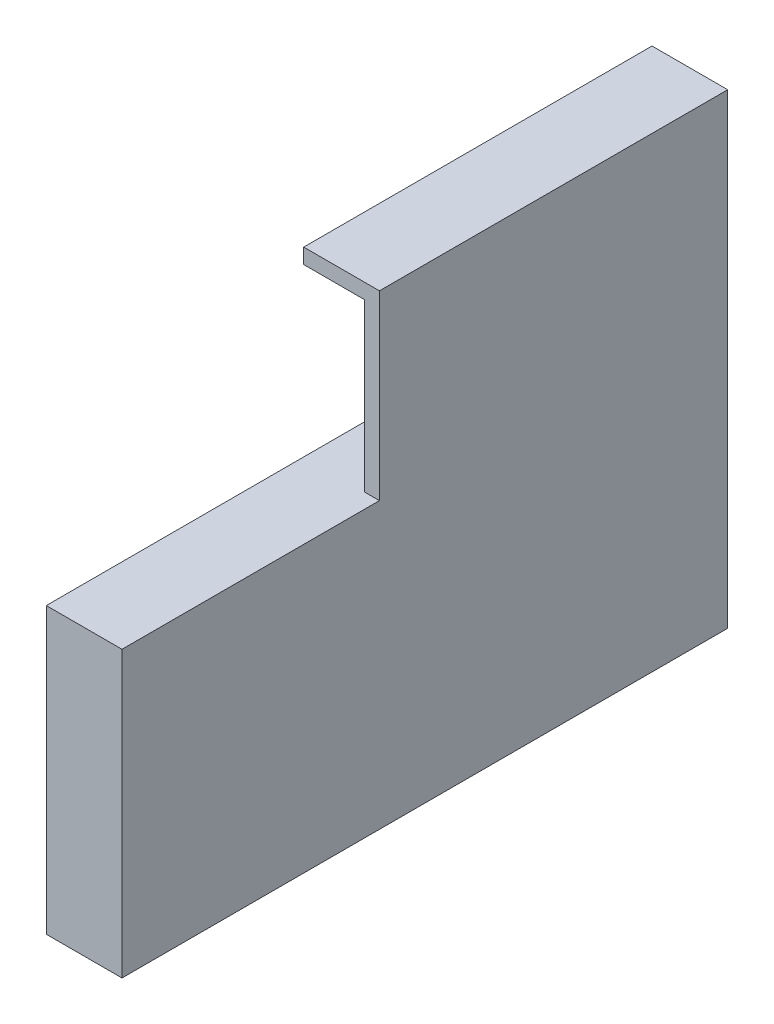
ISO-10303-21;
HEADER;
FILE_DESCRIPTION(('STEP AP214'),'2;1');
FILE_NAME('part.step','',(''),(''),'','','');
FILE_SCHEMA(('AUTOMOTIVE_DESIGN { 1 0 10303 214 1 1 1 1 }'));
ENDSEC;
DATA;
#1=APPLICATION_CONTEXT('core data for automotive mechanical design processes');
#2=APPLICATION_PROTOCOL_DEFINITION('international standard','automotive_design',2000,#1);
#3=PRODUCT_CONTEXT('',#1,'mechanical');
#4=PRODUCT('Part','Part','',(#3));
#5=PRODUCT_RELATED_PRODUCT_CATEGORY('part','',(#4));
#6=PRODUCT_DEFINITION_FORMATION('','',#4);
#7=PRODUCT_DEFINITION_CONTEXT('part definition',#1,'design');
#8=PRODUCT_DEFINITION('design','',#6,#7);
#9=PRODUCT_DEFINITION_SHAPE('','',#8);
#10=(LENGTH_UNIT() NAMED_UNIT(*) SI_UNIT(.MILLI.,.METRE.));
#11=(NAMED_UNIT(*) PLANE_ANGLE_UNIT() SI_UNIT($,.RADIAN.));
#12=(NAMED_UNIT(*) SI_UNIT($,.STERADIAN.) SOLID_ANGLE_UNIT());
#13=UNCERTAINTY_MEASURE_WITH_UNIT(LENGTH_MEASURE(1.E-05),#10,'distance_accuracy_value','');
#14=(GEOMETRIC_REPRESENTATION_CONTEXT(3) GLOBAL_UNCERTAINTY_ASSIGNED_CONTEXT((#13)) GLOBAL_UNIT_ASSIGNED_CONTEXT((#10,
#11,#12)) REPRESENTATION_CONTEXT('',''));
#15=CARTESIAN_POINT('',(0.,0.,0.));
#16=DIRECTION('',(0.,0.,1.));
#17=DIRECTION('',(1.,0.,0.));
#18=AXIS2_PLACEMENT_3D('',#15,#16,#17);
#19=CARTESIAN_POINT('',(-10.,44.5,0.));
#20=DIRECTION('',(0.,1.,0.));
#21=DIRECTION('',(0.,0.,1.));
#22=AXIS2_PLACEMENT_3D('',#19,#20,#21);
#23=PLANE('',#22);
#24=DIRECTION('',(0.,0.,1.));
#25=VECTOR('',#24,1.);
#26=CARTESIAN_POINT('',(2.5,44.5,0.));
#27=LINE('',#26,#25);
#28=CARTESIAN_POINT('',(2.5,44.5,-40.));
#29=VERTEX_POINT('',#28);
#30=CARTESIAN_POINT('',(2.5,44.5,2.50000000000003));
#31=VERTEX_POINT('',#30);
#32=EDGE_CURVE('E214',#29,#31,#27,.T.);
#33=ORIENTED_EDGE('',*,*,#32,.F.);
#34=DIRECTION('',(1.,0.,0.));
#35=VECTOR('',#34,1.);
#36=CARTESIAN_POINT('',(0.,44.5,-40.));
#37=LINE('',#36,#35);
#38=CARTESIAN_POINT('',(0.,44.5,-40.));
#39=VERTEX_POINT('',#38);
#40=EDGE_CURVE('E321',#39,#29,#37,.T.);
#41=ORIENTED_EDGE('',*,*,#40,.F.);
#42=DIRECTION('',(0.,0.,1.));
#43=VECTOR('',#42,1.);
#44=CARTESIAN_POINT('',(0.,44.5,0.));
#45=LINE('',#44,#43);
#46=CARTESIAN_POINT('',(0.,44.5,-95.));
#47=VERTEX_POINT('',#46);
#48=EDGE_CURVE('E325',#47,#39,#45,.T.);
#49=ORIENTED_EDGE('',*,*,#48,.F.);
#50=DIRECTION('',(1.,0.,0.));
#51=VECTOR('',#50,1.);
#52=CARTESIAN_POINT('',(-10.,44.5,-95.));
#53=LINE('',#52,#51);
#54=CARTESIAN_POINT('',(-10.,44.5,-95.));
#55=VERTEX_POINT('',#54);
#56=EDGE_CURVE('E98',#55,#47,#53,.T.);
#57=ORIENTED_EDGE('',*,*,#56,.F.);
#58=DIRECTION('',(0.,0.,1.));
#59=VECTOR('',#58,1.);
#60=CARTESIAN_POINT('',(-10.,44.5,0.));
#61=LINE('',#60,#59);
#62=CARTESIAN_POINT('',(-10.,44.5,2.50000000000003));
#63=VERTEX_POINT('',#62);
#64=EDGE_CURVE('E248',#55,#63,#61,.T.);
#65=ORIENTED_EDGE('',*,*,#64,.T.);
#66=DIRECTION('',(1.,0.,0.));
#67=VECTOR('',#66,1.);
#68=CARTESIAN_POINT('',(-10.,44.5,2.50000000000003));
#69=LINE('',#68,#67);
#70=EDGE_CURVE('E251',#63,#31,#69,.T.);
#71=ORIENTED_EDGE('',*,*,#70,.T.);
#72=EDGE_LOOP('',(#33,#41,#49,#57,#65,#71));
#73=FACE_BOUND('',#72,.T.);
#74=ADVANCED_FACE('F83',(#73),#23,.T.);
#75=CARTESIAN_POINT('',(-10.,0.,-95.));
#76=DIRECTION('',(0.,0.,1.));
#77=DIRECTION('',(1.,0.,0.));
#78=AXIS2_PLACEMENT_3D('',#75,#76,#77);
#79=PLANE('',#78);
#80=ORIENTED_EDGE('',*,*,#56,.T.);
#81=DIRECTION('',(0.,-1.,0.));
#82=VECTOR('',#81,1.);
#83=CARTESIAN_POINT('',(0.,0.,-95.));
#84=LINE('',#83,#82);
#85=CARTESIAN_POINT('',(0.,72.,-95.));
#86=VERTEX_POINT('',#85);
#87=EDGE_CURVE('E180',#86,#47,#84,.T.);
#88=ORIENTED_EDGE('',*,*,#87,.F.);
#89=DIRECTION('',(1.,0.,0.));
#90=VECTOR('',#89,1.);
#91=CARTESIAN_POINT('',(-10.,72.,-95.));
#92=LINE('',#91,#90);
#93=CARTESIAN_POINT('',(-10.,72.,-95.));
#94=VERTEX_POINT('',#93);
#95=EDGE_CURVE('E190',#94,#86,#92,.T.);
#96=ORIENTED_EDGE('',*,*,#95,.F.);
#97=DIRECTION('',(0.,-1.,0.));
#98=VECTOR('',#97,1.);
#99=CARTESIAN_POINT('',(-10.,0.,-95.));
#100=LINE('',#99,#98);
#101=EDGE_CURVE('E345',#94,#55,#100,.T.);
#102=ORIENTED_EDGE('',*,*,#101,.T.);
#103=EDGE_LOOP('',(#80,#88,#96,#102));
#104=FACE_BOUND('',#103,.T.);
#105=ADVANCED_FACE('F188',(#104),#79,.T.);
#106=CARTESIAN_POINT('',(-10.,72.,0.));
#107=DIRECTION('',(0.,-1.,0.));
#108=DIRECTION('',(0.,0.,-1.));
#109=AXIS2_PLACEMENT_3D('',#106,#107,#108);
#110=PLANE('',#109);
#111=ORIENTED_EDGE('',*,*,#95,.T.);
#112=DIRECTION('',(0.,0.,-1.));
#113=VECTOR('',#112,1.);
#114=CARTESIAN_POINT('',(0.,72.,0.));
#115=LINE('',#114,#113);
#116=CARTESIAN_POINT('',(0.,72.,-40.));
#117=VERTEX_POINT('',#116);
#118=EDGE_CURVE('E177',#117,#86,#115,.T.);
#119=ORIENTED_EDGE('',*,*,#118,.F.);
#120=DIRECTION('',(1.,0.,0.));
#121=VECTOR('',#120,1.);
#122=CARTESIAN_POINT('',(-10.,72.,-40.));
#123=LINE('',#122,#121);
#124=CARTESIAN_POINT('',(-10.,72.,-40.));
#125=VERTEX_POINT('',#124);
#126=EDGE_CURVE('E197',#125,#117,#123,.T.);
#127=ORIENTED_EDGE('',*,*,#126,.F.);
#128=DIRECTION('',(0.,0.,-1.));
#129=VECTOR('',#128,1.);
#130=CARTESIAN_POINT('',(-10.,72.,0.));
#131=LINE('',#130,#129);
#132=EDGE_CURVE('E196',#125,#94,#131,.T.);
#133=ORIENTED_EDGE('',*,*,#132,.T.);
#134=EDGE_LOOP('',(#111,#119,#127,#133));
#135=FACE_BOUND('',#134,.T.);
#136=ADVANCED_FACE('F194',(#135),#110,.T.);
#137=CARTESIAN_POINT('',(2.5,0.,0.));
#138=DIRECTION('',(-1.,0.,0.));
#139=DIRECTION('',(0.,0.,1.));
#140=AXIS2_PLACEMENT_3D('',#137,#138,#139);
#141=PLANE('',#140);
#142=DIRECTION('',(0.,1.,0.));
#143=VECTOR('',#142,1.);
#144=CARTESIAN_POINT('',(2.5,-1.11022302462515E-13,-39.9999999999998));
#145=LINE('',#144,#143);
#146=CARTESIAN_POINT('',(2.5,74.5,-40.));
#147=VERTEX_POINT('',#146);
#148=EDGE_CURVE('E315',#29,#147,#145,.T.);
#149=ORIENTED_EDGE('',*,*,#148,.F.);
#150=ORIENTED_EDGE('',*,*,#32,.T.);
#151=DIRECTION('',(0.,-1.,0.));
#152=VECTOR('',#151,1.);
#153=CARTESIAN_POINT('',(2.5,0.,2.5));
#154=LINE('',#153,#152);
#155=CARTESIAN_POINT('',(2.5,-2.5,2.5));
#156=VERTEX_POINT('',#155);
#157=EDGE_CURVE('E205',#31,#156,#154,.T.);
#158=ORIENTED_EDGE('',*,*,#157,.T.);
#159=DIRECTION('',(0.,0.,-1.));
#160=VECTOR('',#159,1.);
#161=CARTESIAN_POINT('',(2.5,-2.5,0.));
#162=LINE('',#161,#160);
#163=CARTESIAN_POINT('',(2.5,-2.5,-97.5));
#164=VERTEX_POINT('',#163);
#165=EDGE_CURVE('E208',#156,#164,#162,.T.);
#166=ORIENTED_EDGE('',*,*,#165,.T.);
#167=DIRECTION('',(0.,1.,0.));
#168=VECTOR('',#167,1.);
#169=CARTESIAN_POINT('',(2.5,0.,-97.5));
#170=LINE('',#169,#168);
#171=CARTESIAN_POINT('',(2.5,74.5,-97.5));
#172=VERTEX_POINT('',#171);
#173=EDGE_CURVE('E212',#164,#172,#170,.T.);
#174=ORIENTED_EDGE('',*,*,#173,.T.);
#175=DIRECTION('',(0.,0.,1.));
#176=VECTOR('',#175,1.);
#177=CARTESIAN_POINT('',(2.5,74.5,0.));
#178=LINE('',#177,#176);
#179=EDGE_CURVE('E318',#172,#147,#178,.T.);
#180=ORIENTED_EDGE('',*,*,#179,.T.);
#181=EDGE_LOOP('',(#149,#150,#158,#166,#174,#180));
#182=FACE_BOUND('',#181,.T.);
#183=ADVANCED_FACE('F305',(#182),#141,.F.);
#184=CARTESIAN_POINT('',(-10.,0.,2.5));
#185=DIRECTION('',(0.,0.,1.));
#186=DIRECTION('',(0.,-1.,0.));
#187=AXIS2_PLACEMENT_3D('',#184,#185,#186);
#188=PLANE('',#187);
#189=DIRECTION('',(1.,0.,0.));
#190=VECTOR('',#189,1.);
#191=CARTESIAN_POINT('',(-10.,-2.5,2.5));
#192=LINE('',#191,#190);
#193=CARTESIAN_POINT('',(-10.,-2.5,2.5));
#194=VERTEX_POINT('',#193);
#195=EDGE_CURVE('E250',#194,#156,#192,.T.);
#196=ORIENTED_EDGE('',*,*,#195,.T.);
#197=ORIENTED_EDGE('',*,*,#157,.F.);
#198=ORIENTED_EDGE('',*,*,#70,.F.);
#199=DIRECTION('',(0.,-1.,0.));
#200=VECTOR('',#199,1.);
#201=CARTESIAN_POINT('',(-10.,0.,2.5));
#202=LINE('',#201,#200);
#203=EDGE_CURVE('E232',#63,#194,#202,.T.);
#204=ORIENTED_EDGE('',*,*,#203,.T.);
#205=EDGE_LOOP('',(#196,#197,#198,#204));
#206=FACE_BOUND('',#205,.T.);
#207=ADVANCED_FACE('F300',(#206),#188,.T.);
#208=CARTESIAN_POINT('',(-10.,0.,-97.5));
#209=DIRECTION('',(0.,0.,-1.));
#210=DIRECTION('',(0.,1.,0.));
#211=AXIS2_PLACEMENT_3D('',#208,#209,#210);
#212=PLANE('',#211);
#213=DIRECTION('',(0.,1.,0.));
#214=VECTOR('',#213,1.);
#215=CARTESIAN_POINT('',(-10.,0.,-97.5));
#216=LINE('',#215,#214);
#217=CARTESIAN_POINT('',(-10.,-2.5,-97.5));
#218=VERTEX_POINT('',#217);
#219=CARTESIAN_POINT('',(-10.,74.5,-97.5));
#220=VERTEX_POINT('',#219);
#221=EDGE_CURVE('E246',#218,#220,#216,.T.);
#222=ORIENTED_EDGE('',*,*,#221,.T.);
#223=DIRECTION('',(1.,0.,0.));
#224=VECTOR('',#223,1.);
#225=CARTESIAN_POINT('',(-10.,74.5,-97.5));
#226=LINE('',#225,#224);
#227=EDGE_CURVE('E199',#220,#172,#226,.T.);
#228=ORIENTED_EDGE('',*,*,#227,.T.);
#229=ORIENTED_EDGE('',*,*,#173,.F.);
#230=DIRECTION('',(1.,0.,0.));
#231=VECTOR('',#230,1.);
#232=CARTESIAN_POINT('',(-10.,-2.5,-97.5));
#233=LINE('',#232,#231);
#234=EDGE_CURVE('E254',#218,#164,#233,.T.);
#235=ORIENTED_EDGE('',*,*,#234,.F.);
#236=EDGE_LOOP('',(#222,#228,#229,#235));
#237=FACE_BOUND('',#236,.T.);
#238=ADVANCED_FACE('F297',(#237),#212,.T.);
#239=CARTESIAN_POINT('',(-10.,-2.5,0.));
#240=DIRECTION('',(0.,-1.,0.));
#241=DIRECTION('',(0.,0.,-1.));
#242=AXIS2_PLACEMENT_3D('',#239,#240,#241);
#243=PLANE('',#242);
#244=ORIENTED_EDGE('',*,*,#234,.T.);
#245=ORIENTED_EDGE('',*,*,#165,.F.);
#246=ORIENTED_EDGE('',*,*,#195,.F.);
#247=DIRECTION('',(0.,0.,-1.));
#248=VECTOR('',#247,1.);
#249=CARTESIAN_POINT('',(-10.,-2.5,0.));
#250=LINE('',#249,#248);
#251=EDGE_CURVE('E243',#194,#218,#250,.T.);
#252=ORIENTED_EDGE('',*,*,#251,.T.);
#253=EDGE_LOOP('',(#244,#245,#246,#252));
#254=FACE_BOUND('',#253,.T.);
#255=ADVANCED_FACE('F284',(#254),#243,.T.);
#256=CARTESIAN_POINT('',(-10.,0.,0.));
#257=DIRECTION('',(1.,0.,0.));
#258=DIRECTION('',(0.,0.,-1.));
#259=AXIS2_PLACEMENT_3D('',#256,#257,#258);
#260=PLANE('',#259);
#261=DIRECTION('',(0.,0.,1.));
#262=VECTOR('',#261,1.);
#263=CARTESIAN_POINT('',(-10.,42.,0.));
#264=LINE('',#263,#262);
#265=CARTESIAN_POINT('',(-10.,42.,-95.));
#266=VERTEX_POINT('',#265);
#267=CARTESIAN_POINT('',(-10.,42.,0.));
#268=VERTEX_POINT('',#267);
#269=EDGE_CURVE('E225',#266,#268,#264,.T.);
#270=ORIENTED_EDGE('',*,*,#269,.T.);
#271=DIRECTION('',(0.,-1.,0.));
#272=VECTOR('',#271,1.);
#273=CARTESIAN_POINT('',(-10.,0.,0.));
#274=LINE('',#273,#272);
#275=CARTESIAN_POINT('',(-10.,0.,0.));
#276=VERTEX_POINT('',#275);
#277=EDGE_CURVE('E216',#268,#276,#274,.T.);
#278=ORIENTED_EDGE('',*,*,#277,.T.);
#279=DIRECTION('',(0.,0.,-1.));
#280=VECTOR('',#279,1.);
#281=CARTESIAN_POINT('',(-10.,0.,0.));
#282=LINE('',#281,#280);
#283=CARTESIAN_POINT('',(-10.,0.,-95.));
#284=VERTEX_POINT('',#283);
#285=EDGE_CURVE('E219',#276,#284,#282,.T.);
#286=ORIENTED_EDGE('',*,*,#285,.T.);
#287=DIRECTION('',(0.,1.,0.));
#288=VECTOR('',#287,1.);
#289=CARTESIAN_POINT('',(-10.,0.,-95.));
#290=LINE('',#289,#288);
#291=EDGE_CURVE('E222',#284,#266,#290,.T.);
#292=ORIENTED_EDGE('',*,*,#291,.T.);
#293=EDGE_LOOP('',(#270,#278,#286,#292));
#294=FACE_BOUND('',#293,.T.);
#295=ORIENTED_EDGE('',*,*,#203,.F.);
#296=ORIENTED_EDGE('',*,*,#64,.F.);
#297=ORIENTED_EDGE('',*,*,#101,.F.);
#298=ORIENTED_EDGE('',*,*,#132,.F.);
#299=DIRECTION('',(0.,1.,0.));
#300=VECTOR('',#299,1.);
#301=CARTESIAN_POINT('',(-10.,-1.11022302462515E-13,-39.9999999999998));
#302=LINE('',#301,#300);
#303=CARTESIAN_POINT('',(-10.,74.5,-40.));
#304=VERTEX_POINT('',#303);
#305=EDGE_CURVE('E339',#125,#304,#302,.T.);
#306=ORIENTED_EDGE('',*,*,#305,.T.);
#307=DIRECTION('',(0.,0.,1.));
#308=VECTOR('',#307,1.);
#309=CARTESIAN_POINT('',(-10.,74.5,0.));
#310=LINE('',#309,#308);
#311=EDGE_CURVE('E201',#220,#304,#310,.T.);
#312=ORIENTED_EDGE('',*,*,#311,.F.);
#313=ORIENTED_EDGE('',*,*,#221,.F.);
#314=ORIENTED_EDGE('',*,*,#251,.F.);
#315=EDGE_LOOP('',(#295,#296,#297,#298,#306,#312,#313,#314));
#316=FACE_BOUND('',#315,.T.);
#317=ADVANCED_FACE('F269',(#294,#316),#260,.F.);
#318=CARTESIAN_POINT('',(-10.,0.,0.));
#319=DIRECTION('',(0.,0.,1.));
#320=DIRECTION('',(0.,-1.,0.));
#321=AXIS2_PLACEMENT_3D('',#318,#319,#320);
#322=PLANE('',#321);
#323=DIRECTION('',(0.,-1.,0.));
#324=VECTOR('',#323,1.);
#325=CARTESIAN_POINT('',(0.,0.,0.));
#326=LINE('',#325,#324);
#327=CARTESIAN_POINT('',(0.,42.,0.));
#328=VERTEX_POINT('',#327);
#329=CARTESIAN_POINT('',(0.,0.,0.));
#330=VERTEX_POINT('',#329);
#331=EDGE_CURVE('E106',#328,#330,#326,.T.);
#332=ORIENTED_EDGE('',*,*,#331,.T.);
#333=DIRECTION('',(1.,0.,0.));
#334=VECTOR('',#333,1.);
#335=CARTESIAN_POINT('',(-10.,0.,0.));
#336=LINE('',#335,#334);
#337=EDGE_CURVE('E228',#276,#330,#336,.T.);
#338=ORIENTED_EDGE('',*,*,#337,.F.);
#339=ORIENTED_EDGE('',*,*,#277,.F.);
#340=DIRECTION('',(1.,0.,0.));
#341=VECTOR('',#340,1.);
#342=CARTESIAN_POINT('',(-10.,42.,0.));
#343=LINE('',#342,#341);
#344=EDGE_CURVE('E229',#268,#328,#343,.T.);
#345=ORIENTED_EDGE('',*,*,#344,.T.);
#346=EDGE_LOOP('',(#332,#338,#339,#345));
#347=FACE_BOUND('',#346,.T.);
#348=ADVANCED_FACE('F275',(#347),#322,.F.);
#349=CARTESIAN_POINT('',(-10.,42.,0.));
#350=DIRECTION('',(0.,1.,0.));
#351=DIRECTION('',(0.,0.,1.));
#352=AXIS2_PLACEMENT_3D('',#349,#350,#351);
#353=PLANE('',#352);
#354=DIRECTION('',(0.,0.,1.));
#355=VECTOR('',#354,1.);
#356=CARTESIAN_POINT('',(0.,42.,0.));
#357=LINE('',#356,#355);
#358=CARTESIAN_POINT('',(0.,42.,-95.));
#359=VERTEX_POINT('',#358);
#360=EDGE_CURVE('E12',#359,#328,#357,.T.);
#361=ORIENTED_EDGE('',*,*,#360,.T.);
#362=ORIENTED_EDGE('',*,*,#344,.F.);
#363=ORIENTED_EDGE('',*,*,#269,.F.);
#364=DIRECTION('',(1.,0.,0.));
#365=VECTOR('',#364,1.);
#366=CARTESIAN_POINT('',(-10.,42.,-95.));
#367=LINE('',#366,#365);
#368=EDGE_CURVE('E233',#266,#359,#367,.T.);
#369=ORIENTED_EDGE('',*,*,#368,.T.);
#370=EDGE_LOOP('',(#361,#362,#363,#369));
#371=FACE_BOUND('',#370,.T.);
#372=ADVANCED_FACE('F266',(#371),#353,.F.);
#373=CARTESIAN_POINT('',(-10.,0.,-95.));
#374=DIRECTION('',(0.,0.,-1.));
#375=DIRECTION('',(0.,1.,0.));
#376=AXIS2_PLACEMENT_3D('',#373,#374,#375);
#377=PLANE('',#376);
#378=DIRECTION('',(0.,1.,0.));
#379=VECTOR('',#378,1.);
#380=CARTESIAN_POINT('',(0.,0.,-95.));
#381=LINE('',#380,#379);
#382=CARTESIAN_POINT('',(0.,0.,-95.));
#383=VERTEX_POINT('',#382);
#384=EDGE_CURVE('E91',#383,#359,#381,.T.);
#385=ORIENTED_EDGE('',*,*,#384,.T.);
#386=ORIENTED_EDGE('',*,*,#368,.F.);
#387=ORIENTED_EDGE('',*,*,#291,.F.);
#388=DIRECTION('',(1.,0.,0.));
#389=VECTOR('',#388,1.);
#390=CARTESIAN_POINT('',(-10.,0.,-95.));
#391=LINE('',#390,#389);
#392=EDGE_CURVE('E236',#284,#383,#391,.T.);
#393=ORIENTED_EDGE('',*,*,#392,.T.);
#394=EDGE_LOOP('',(#385,#386,#387,#393));
#395=FACE_BOUND('',#394,.T.);
#396=ADVANCED_FACE('F262',(#395),#377,.F.);
#397=CARTESIAN_POINT('',(-10.,0.,0.));
#398=DIRECTION('',(0.,-1.,0.));
#399=DIRECTION('',(0.,0.,-1.));
#400=AXIS2_PLACEMENT_3D('',#397,#398,#399);
#401=PLANE('',#400);
#402=DIRECTION('',(0.,0.,-1.));
#403=VECTOR('',#402,1.);
#404=CARTESIAN_POINT('',(0.,0.,0.));
#405=LINE('',#404,#403);
#406=EDGE_CURVE('E258',#330,#383,#405,.T.);
#407=ORIENTED_EDGE('',*,*,#406,.T.);
#408=ORIENTED_EDGE('',*,*,#392,.F.);
#409=ORIENTED_EDGE('',*,*,#285,.F.);
#410=ORIENTED_EDGE('',*,*,#337,.T.);
#411=EDGE_LOOP('',(#407,#408,#409,#410));
#412=FACE_BOUND('',#411,.T.);
#413=ADVANCED_FACE('F273',(#412),#401,.F.);
#414=CARTESIAN_POINT('',(0.,0.,0.));
#415=DIRECTION('',(-1.,0.,0.));
#416=DIRECTION('',(0.,0.,1.));
#417=AXIS2_PLACEMENT_3D('',#414,#415,#416);
#418=PLANE('',#417);
#419=ORIENTED_EDGE('',*,*,#331,.F.);
#420=ORIENTED_EDGE('',*,*,#360,.F.);
#421=ORIENTED_EDGE('',*,*,#384,.F.);
#422=ORIENTED_EDGE('',*,*,#406,.F.);
#423=EDGE_LOOP('',(#419,#420,#421,#422));
#424=FACE_BOUND('',#423,.T.);
#425=ADVANCED_FACE('F85',(#424),#418,.T.);
#426=CARTESIAN_POINT('',(-10.,-1.11022302462515E-13,-39.9999999999998));
#427=DIRECTION('',(0.,0.,-1.));
#428=DIRECTION('',(0.,1.,0.));
#429=AXIS2_PLACEMENT_3D('',#426,#427,#428);
#430=PLANE('',#429);
#431=ORIENTED_EDGE('',*,*,#148,.T.);
#432=DIRECTION('',(1.,0.,0.));
#433=VECTOR('',#432,1.);
#434=CARTESIAN_POINT('',(-10.,74.5,-40.));
#435=LINE('',#434,#433);
#436=EDGE_CURVE('E209',#304,#147,#435,.T.);
#437=ORIENTED_EDGE('',*,*,#436,.F.);
#438=ORIENTED_EDGE('',*,*,#305,.F.);
#439=ORIENTED_EDGE('',*,*,#126,.T.);
#440=DIRECTION('',(0.,1.,0.));
#441=VECTOR('',#440,1.);
#442=CARTESIAN_POINT('',(0.,0.,-40.));
#443=LINE('',#442,#441);
#444=EDGE_CURVE('E182',#39,#117,#443,.T.);
#445=ORIENTED_EDGE('',*,*,#444,.F.);
#446=ORIENTED_EDGE('',*,*,#40,.T.);
#447=EDGE_LOOP('',(#431,#437,#438,#439,#445,#446));
#448=FACE_BOUND('',#447,.T.);
#449=ADVANCED_FACE('F324',(#448),#430,.F.);
#450=CARTESIAN_POINT('',(-10.,74.5,0.));
#451=DIRECTION('',(0.,1.,0.));
#452=DIRECTION('',(0.,0.,1.));
#453=AXIS2_PLACEMENT_3D('',#450,#451,#452);
#454=PLANE('',#453);
#455=ORIENTED_EDGE('',*,*,#179,.F.);
#456=ORIENTED_EDGE('',*,*,#227,.F.);
#457=ORIENTED_EDGE('',*,*,#311,.T.);
#458=ORIENTED_EDGE('',*,*,#436,.T.);
#459=EDGE_LOOP('',(#455,#456,#457,#458));
#460=FACE_BOUND('',#459,.T.);
#461=ADVANCED_FACE('F338',(#460),#454,.T.);
#462=CARTESIAN_POINT('',(0.,0.,0.));
#463=DIRECTION('',(1.,0.,0.));
#464=DIRECTION('',(0.,0.,-1.));
#465=AXIS2_PLACEMENT_3D('',#462,#463,#464);
#466=PLANE('',#465);
#467=ORIENTED_EDGE('',*,*,#87,.T.);
#468=ORIENTED_EDGE('',*,*,#48,.T.);
#469=ORIENTED_EDGE('',*,*,#444,.T.);
#470=ORIENTED_EDGE('',*,*,#118,.T.);
#471=EDGE_LOOP('',(#467,#468,#469,#470));
#472=FACE_BOUND('',#471,.T.);
#473=ADVANCED_FACE('F179',(#472),#466,.F.);
#474=CLOSED_SHELL('',(#74,#105,#136,#183,#207,#238,#255,#317,#348,#372,#396,#413,#425,#449,#461,#473));
#475=MANIFOLD_SOLID_BREP('B2',#474);
#476=ADVANCED_BREP_SHAPE_REPRESENTATION('',(#18,#475),#14);
#477=SHAPE_DEFINITION_REPRESENTATION(#9,#476);
ENDSEC;
END-ISO-10303-21;
